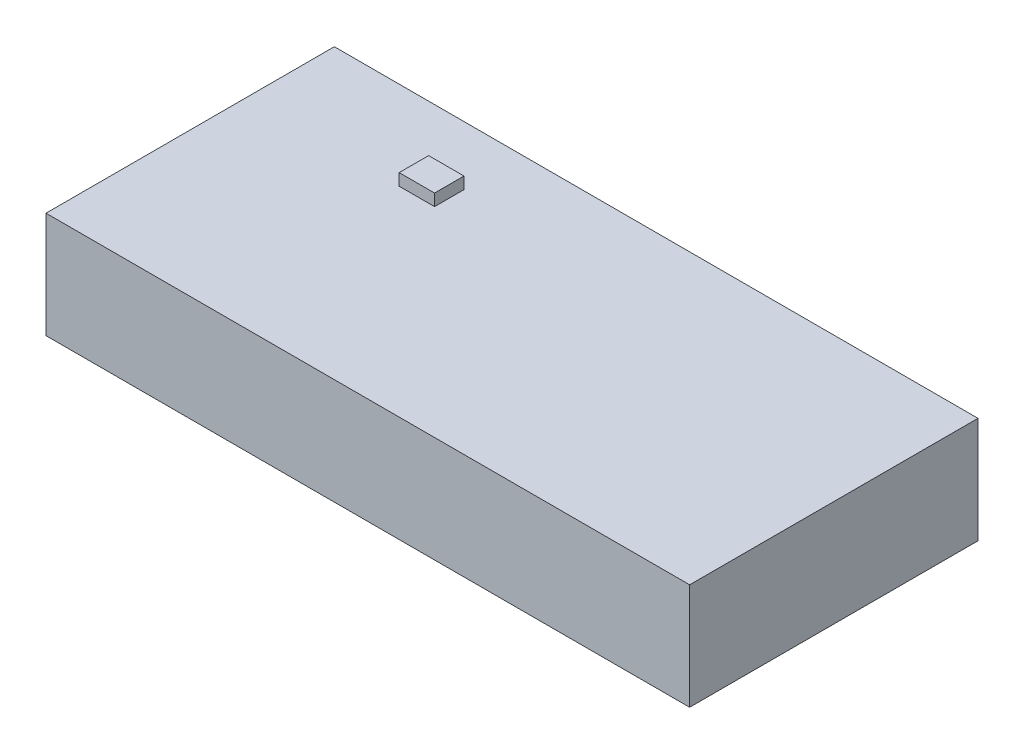
ISO-10303-21;
HEADER;
FILE_DESCRIPTION(('STEP AP214'),'2;1');
FILE_NAME('part.step','',(''),(''),'','','');
FILE_SCHEMA(('AUTOMOTIVE_DESIGN { 1 0 10303 214 1 1 1 1 }'));
ENDSEC;
DATA;
#1=APPLICATION_CONTEXT('core data for automotive mechanical design processes');
#2=APPLICATION_PROTOCOL_DEFINITION('international standard','automotive_design',2000,#1);
#3=PRODUCT_CONTEXT('',#1,'mechanical');
#4=PRODUCT('Part','Part','',(#3));
#5=PRODUCT_RELATED_PRODUCT_CATEGORY('part','',(#4));
#6=PRODUCT_DEFINITION_FORMATION('','',#4);
#7=PRODUCT_DEFINITION_CONTEXT('part definition',#1,'design');
#8=PRODUCT_DEFINITION('design','',#6,#7);
#9=PRODUCT_DEFINITION_SHAPE('','',#8);
#10=(LENGTH_UNIT() NAMED_UNIT(*) SI_UNIT(.MILLI.,.METRE.));
#11=(NAMED_UNIT(*) PLANE_ANGLE_UNIT() SI_UNIT($,.RADIAN.));
#12=(NAMED_UNIT(*) SI_UNIT($,.STERADIAN.) SOLID_ANGLE_UNIT());
#13=UNCERTAINTY_MEASURE_WITH_UNIT(LENGTH_MEASURE(1.E-05),#10,'distance_accuracy_value','');
#14=(GEOMETRIC_REPRESENTATION_CONTEXT(3) GLOBAL_UNCERTAINTY_ASSIGNED_CONTEXT((#13)) GLOBAL_UNIT_ASSIGNED_CONTEXT((#10,
#11,#12)) REPRESENTATION_CONTEXT('',''));
#15=CARTESIAN_POINT('',(0.,0.,0.));
#16=DIRECTION('',(0.,0.,1.));
#17=DIRECTION('',(1.,0.,0.));
#18=AXIS2_PLACEMENT_3D('',#15,#16,#17);
#19=CARTESIAN_POINT('',(0.,11.43,0.));
#20=DIRECTION('',(0.,1.,0.));
#21=DIRECTION('',(0.,0.,1.));
#22=AXIS2_PLACEMENT_3D('',#19,#20,#21);
#23=PLANE('',#22);
#24=DIRECTION('',(0.,0.,-1.));
#25=VECTOR('',#24,1.);
#26=CARTESIAN_POINT('',(69.342,11.43,-31.0642));
#27=LINE('',#26,#25);
#28=CARTESIAN_POINT('',(69.342,11.43,31.0642));
#29=VERTEX_POINT('',#28);
#30=CARTESIAN_POINT('',(69.342,11.43,-31.0642));
#31=VERTEX_POINT('',#30);
#32=EDGE_CURVE('E237',#29,#31,#27,.T.);
#33=ORIENTED_EDGE('',*,*,#32,.T.);
#34=DIRECTION('',(-1.,0.,0.));
#35=VECTOR('',#34,1.);
#36=CARTESIAN_POINT('',(-69.342,11.43,-31.0642));
#37=LINE('',#36,#35);
#38=CARTESIAN_POINT('',(-69.342,11.43,-31.0642));
#39=VERTEX_POINT('',#38);
#40=EDGE_CURVE('E240',#31,#39,#37,.T.);
#41=ORIENTED_EDGE('',*,*,#40,.T.);
#42=DIRECTION('',(0.,0.,1.));
#43=VECTOR('',#42,1.);
#44=CARTESIAN_POINT('',(-69.342,11.43,-31.0642));
#45=LINE('',#44,#43);
#46=CARTESIAN_POINT('',(-69.342,11.43,31.0642));
#47=VERTEX_POINT('',#46);
#48=EDGE_CURVE('E243',#39,#47,#45,.T.);
#49=ORIENTED_EDGE('',*,*,#48,.T.);
#50=DIRECTION('',(1.,0.,0.));
#51=VECTOR('',#50,1.);
#52=CARTESIAN_POINT('',(-69.342,11.43,31.0642));
#53=LINE('',#52,#51);
#54=EDGE_CURVE('E245',#47,#29,#53,.T.);
#55=ORIENTED_EDGE('',*,*,#54,.T.);
#56=EDGE_LOOP('',(#33,#41,#49,#55));
#57=FACE_BOUND('',#56,.T.);
#58=DIRECTION('',(-1.,0.,0.));
#59=VECTOR('',#58,1.);
#60=CARTESIAN_POINT('',(-36.322,11.43,-18.3642));
#61=LINE('',#60,#59);
#62=CARTESIAN_POINT('',(-28.702,11.43,-18.3642));
#63=VERTEX_POINT('',#62);
#64=CARTESIAN_POINT('',(-36.322,11.43,-18.3642));
#65=VERTEX_POINT('',#64);
#66=EDGE_CURVE('E478',#63,#65,#61,.T.);
#67=ORIENTED_EDGE('',*,*,#66,.F.);
#68=DIRECTION('',(0.,0.,-1.));
#69=VECTOR('',#68,1.);
#70=CARTESIAN_POINT('',(-28.702,11.43,-18.3642));
#71=LINE('',#70,#69);
#72=CARTESIAN_POINT('',(-28.702,11.43,-12.0142));
#73=VERTEX_POINT('',#72);
#74=EDGE_CURVE('E168',#73,#63,#71,.T.);
#75=ORIENTED_EDGE('',*,*,#74,.F.);
#76=DIRECTION('',(1.,0.,0.));
#77=VECTOR('',#76,1.);
#78=CARTESIAN_POINT('',(-36.322,11.43,-12.0142));
#79=LINE('',#78,#77);
#80=CARTESIAN_POINT('',(-36.322,11.43,-12.0142));
#81=VERTEX_POINT('',#80);
#82=EDGE_CURVE('E164',#81,#73,#79,.T.);
#83=ORIENTED_EDGE('',*,*,#82,.F.);
#84=DIRECTION('',(0.,0.,1.));
#85=VECTOR('',#84,1.);
#86=CARTESIAN_POINT('',(-36.322,11.43,-18.3642));
#87=LINE('',#86,#85);
#88=EDGE_CURVE('E475',#65,#81,#87,.T.);
#89=ORIENTED_EDGE('',*,*,#88,.F.);
#90=EDGE_LOOP('',(#67,#75,#83,#89));
#91=FACE_BOUND('',#90,.T.);
#92=ADVANCED_FACE('F32',(#57,#91),#23,.T.);
#93=CARTESIAN_POINT('',(69.342,11.43,-31.0642));
#94=DIRECTION('',(-1.,0.,0.));
#95=DIRECTION('',(0.,0.,1.));
#96=AXIS2_PLACEMENT_3D('',#93,#94,#95);
#97=PLANE('',#96);
#98=DIRECTION('',(0.,0.,-1.));
#99=VECTOR('',#98,1.);
#100=CARTESIAN_POINT('',(69.342,-11.43,-31.0642));
#101=LINE('',#100,#99);
#102=CARTESIAN_POINT('',(69.342,-11.43,31.0642));
#103=VERTEX_POINT('',#102);
#104=CARTESIAN_POINT('',(69.342,-11.43,-31.0642));
#105=VERTEX_POINT('',#104);
#106=EDGE_CURVE('E203',#103,#105,#101,.T.);
#107=ORIENTED_EDGE('',*,*,#106,.T.);
#108=DIRECTION('',(0.,-1.,0.));
#109=VECTOR('',#108,1.);
#110=CARTESIAN_POINT('',(69.342,11.43,-31.0642));
#111=LINE('',#110,#109);
#112=EDGE_CURVE('E11',#31,#105,#111,.T.);
#113=ORIENTED_EDGE('',*,*,#112,.F.);
#114=ORIENTED_EDGE('',*,*,#32,.F.);
#115=DIRECTION('',(0.,-1.,0.));
#116=VECTOR('',#115,1.);
#117=CARTESIAN_POINT('',(69.342,11.43,31.0642));
#118=LINE('',#117,#116);
#119=EDGE_CURVE('E247',#29,#103,#118,.T.);
#120=ORIENTED_EDGE('',*,*,#119,.T.);
#121=EDGE_LOOP('',(#107,#113,#114,#120));
#122=FACE_BOUND('',#121,.T.);
#123=ADVANCED_FACE('F34',(#122),#97,.F.);
#124=CARTESIAN_POINT('',(-69.342,11.43,-31.0642));
#125=DIRECTION('',(0.,0.,1.));
#126=DIRECTION('',(1.,0.,0.));
#127=AXIS2_PLACEMENT_3D('',#124,#125,#126);
#128=PLANE('',#127);
#129=DIRECTION('',(1.,0.,0.));
#130=VECTOR('',#129,1.);
#131=CARTESIAN_POINT('',(-23.622,3.175,-31.0642));
#132=LINE('',#131,#130);
#133=CARTESIAN_POINT('',(-36.322,3.175,-31.0642));
#134=VERTEX_POINT('',#133);
#135=CARTESIAN_POINT('',(-23.622,3.175,-31.0642));
#136=VERTEX_POINT('',#135);
#137=EDGE_CURVE('E192',#134,#136,#132,.T.);
#138=ORIENTED_EDGE('',*,*,#137,.F.);
#139=DIRECTION('',(0.,1.,0.));
#140=VECTOR('',#139,1.);
#141=CARTESIAN_POINT('',(-36.322,3.175,-31.0642));
#142=LINE('',#141,#140);
#143=CARTESIAN_POINT('',(-36.322,-3.175,-31.0642));
#144=VERTEX_POINT('',#143);
#145=EDGE_CURVE('E55',#144,#134,#142,.T.);
#146=ORIENTED_EDGE('',*,*,#145,.F.);
#147=DIRECTION('',(-1.,0.,0.));
#148=VECTOR('',#147,1.);
#149=CARTESIAN_POINT('',(-23.622,-3.175,-31.0642));
#150=LINE('',#149,#148);
#151=CARTESIAN_POINT('',(-23.622,-3.175,-31.0642));
#152=VERTEX_POINT('',#151);
#153=EDGE_CURVE('E181',#152,#144,#150,.T.);
#154=ORIENTED_EDGE('',*,*,#153,.F.);
#155=DIRECTION('',(0.,-1.,0.));
#156=VECTOR('',#155,1.);
#157=CARTESIAN_POINT('',(-23.622,3.175,-31.0642));
#158=LINE('',#157,#156);
#159=EDGE_CURVE('E196',#136,#152,#158,.T.);
#160=ORIENTED_EDGE('',*,*,#159,.F.);
#161=EDGE_LOOP('',(#138,#146,#154,#160));
#162=FACE_BOUND('',#161,.T.);
#163=DIRECTION('',(1.,0.,0.));
#164=VECTOR('',#163,1.);
#165=CARTESIAN_POINT('',(-43.942,3.175,-31.0642));
#166=LINE('',#165,#164);
#167=CARTESIAN_POINT('',(-56.642,3.175,-31.0642));
#168=VERTEX_POINT('',#167);
#169=CARTESIAN_POINT('',(-43.942,3.175,-31.0642));
#170=VERTEX_POINT('',#169);
#171=EDGE_CURVE('E172',#168,#170,#166,.T.);
#172=ORIENTED_EDGE('',*,*,#171,.F.);
#173=DIRECTION('',(0.,1.,0.));
#174=VECTOR('',#173,1.);
#175=CARTESIAN_POINT('',(-56.642,3.175,-31.0642));
#176=LINE('',#175,#174);
#177=CARTESIAN_POINT('',(-56.642,-3.175,-31.0642));
#178=VERTEX_POINT('',#177);
#179=EDGE_CURVE('E170',#178,#168,#176,.T.);
#180=ORIENTED_EDGE('',*,*,#179,.F.);
#181=DIRECTION('',(-1.,0.,0.));
#182=VECTOR('',#181,1.);
#183=CARTESIAN_POINT('',(-43.942,-3.175,-31.0642));
#184=LINE('',#183,#182);
#185=CARTESIAN_POINT('',(-43.942,-3.175,-31.0642));
#186=VERTEX_POINT('',#185);
#187=EDGE_CURVE('E213',#186,#178,#184,.T.);
#188=ORIENTED_EDGE('',*,*,#187,.F.);
#189=DIRECTION('',(0.,-1.,0.));
#190=VECTOR('',#189,1.);
#191=CARTESIAN_POINT('',(-43.942,3.175,-31.0642));
#192=LINE('',#191,#190);
#193=EDGE_CURVE('E225',#170,#186,#192,.T.);
#194=ORIENTED_EDGE('',*,*,#193,.F.);
#195=EDGE_LOOP('',(#172,#180,#188,#194));
#196=FACE_BOUND('',#195,.T.);
#197=DIRECTION('',(-1.,0.,0.));
#198=VECTOR('',#197,1.);
#199=CARTESIAN_POINT('',(-69.342,-11.43,-31.0642));
#200=LINE('',#199,#198);
#201=CARTESIAN_POINT('',(-69.342,-11.43,-31.0642));
#202=VERTEX_POINT('',#201);
#203=EDGE_CURVE('E250',#105,#202,#200,.T.);
#204=ORIENTED_EDGE('',*,*,#203,.T.);
#205=DIRECTION('',(0.,-1.,0.));
#206=VECTOR('',#205,1.);
#207=CARTESIAN_POINT('',(-69.342,11.43,-31.0642));
#208=LINE('',#207,#206);
#209=EDGE_CURVE('E40',#39,#202,#208,.T.);
#210=ORIENTED_EDGE('',*,*,#209,.F.);
#211=ORIENTED_EDGE('',*,*,#40,.F.);
#212=ORIENTED_EDGE('',*,*,#112,.T.);
#213=EDGE_LOOP('',(#204,#210,#211,#212));
#214=FACE_BOUND('',#213,.T.);
#215=ADVANCED_FACE('F280',(#162,#196,#214),#128,.F.);
#216=CARTESIAN_POINT('',(-69.342,11.43,-31.0642));
#217=DIRECTION('',(1.,0.,0.));
#218=DIRECTION('',(0.,0.,-1.));
#219=AXIS2_PLACEMENT_3D('',#216,#217,#218);
#220=PLANE('',#219);
#221=DIRECTION('',(0.,0.,1.));
#222=VECTOR('',#221,1.);
#223=CARTESIAN_POINT('',(-69.342,-11.43,-31.0642));
#224=LINE('',#223,#222);
#225=CARTESIAN_POINT('',(-69.342,-11.43,31.0642));
#226=VERTEX_POINT('',#225);
#227=EDGE_CURVE('E252',#202,#226,#224,.T.);
#228=ORIENTED_EDGE('',*,*,#227,.T.);
#229=DIRECTION('',(0.,-1.,0.));
#230=VECTOR('',#229,1.);
#231=CARTESIAN_POINT('',(-69.342,11.43,31.0642));
#232=LINE('',#231,#230);
#233=EDGE_CURVE('E257',#47,#226,#232,.T.);
#234=ORIENTED_EDGE('',*,*,#233,.F.);
#235=ORIENTED_EDGE('',*,*,#48,.F.);
#236=ORIENTED_EDGE('',*,*,#209,.T.);
#237=EDGE_LOOP('',(#228,#234,#235,#236));
#238=FACE_BOUND('',#237,.T.);
#239=ADVANCED_FACE('F264',(#238),#220,.F.);
#240=CARTESIAN_POINT('',(-69.342,11.43,31.0642));
#241=DIRECTION('',(0.,0.,-1.));
#242=DIRECTION('',(-1.,0.,0.));
#243=AXIS2_PLACEMENT_3D('',#240,#241,#242);
#244=PLANE('',#243);
#245=DIRECTION('',(1.,0.,0.));
#246=VECTOR('',#245,1.);
#247=CARTESIAN_POINT('',(-69.342,-11.43,31.0642));
#248=LINE('',#247,#246);
#249=EDGE_CURVE('E241',#226,#103,#248,.T.);
#250=ORIENTED_EDGE('',*,*,#249,.T.);
#251=ORIENTED_EDGE('',*,*,#119,.F.);
#252=ORIENTED_EDGE('',*,*,#54,.F.);
#253=ORIENTED_EDGE('',*,*,#233,.T.);
#254=EDGE_LOOP('',(#250,#251,#252,#253));
#255=FACE_BOUND('',#254,.T.);
#256=ADVANCED_FACE('F273',(#255),#244,.F.);
#257=CARTESIAN_POINT('',(0.,-11.43,0.));
#258=DIRECTION('',(0.,1.,0.));
#259=DIRECTION('',(0.,0.,1.));
#260=AXIS2_PLACEMENT_3D('',#257,#258,#259);
#261=PLANE('',#260);
#262=ORIENTED_EDGE('',*,*,#106,.F.);
#263=ORIENTED_EDGE('',*,*,#249,.F.);
#264=ORIENTED_EDGE('',*,*,#227,.F.);
#265=ORIENTED_EDGE('',*,*,#203,.F.);
#266=EDGE_LOOP('',(#262,#263,#264,#265));
#267=FACE_BOUND('',#266,.T.);
#268=ADVANCED_FACE('F270',(#267),#261,.F.);
#269=CARTESIAN_POINT('',(-56.642,3.175,-18.3642));
#270=DIRECTION('',(-1.,0.,0.));
#271=DIRECTION('',(0.,-1.,0.));
#272=AXIS2_PLACEMENT_3D('',#269,#270,#271);
#273=PLANE('',#272);
#274=ORIENTED_EDGE('',*,*,#179,.T.);
#275=DIRECTION('',(0.,0.,-1.));
#276=VECTOR('',#275,1.);
#277=CARTESIAN_POINT('',(-56.642,3.175,-18.3642));
#278=LINE('',#277,#276);
#279=CARTESIAN_POINT('',(-56.642,3.175,-18.3642));
#280=VERTEX_POINT('',#279);
#281=EDGE_CURVE('E221',#280,#168,#278,.T.);
#282=ORIENTED_EDGE('',*,*,#281,.F.);
#283=DIRECTION('',(0.,1.,0.));
#284=VECTOR('',#283,1.);
#285=CARTESIAN_POINT('',(-56.642,3.175,-18.3642));
#286=LINE('',#285,#284);
#287=CARTESIAN_POINT('',(-56.642,-3.175,-18.3642));
#288=VERTEX_POINT('',#287);
#289=EDGE_CURVE('E209',#288,#280,#286,.T.);
#290=ORIENTED_EDGE('',*,*,#289,.F.);
#291=DIRECTION('',(0.,0.,-1.));
#292=VECTOR('',#291,1.);
#293=CARTESIAN_POINT('',(-56.642,-3.175,-18.3642));
#294=LINE('',#293,#292);
#295=EDGE_CURVE('E193',#288,#178,#294,.T.);
#296=ORIENTED_EDGE('',*,*,#295,.T.);
#297=EDGE_LOOP('',(#274,#282,#290,#296));
#298=FACE_BOUND('',#297,.T.);
#299=ADVANCED_FACE('F296',(#298),#273,.F.);
#300=CARTESIAN_POINT('',(-43.942,-3.175,-18.3642));
#301=DIRECTION('',(0.,-1.,0.));
#302=DIRECTION('',(0.,0.,-1.));
#303=AXIS2_PLACEMENT_3D('',#300,#301,#302);
#304=PLANE('',#303);
#305=ORIENTED_EDGE('',*,*,#187,.T.);
#306=ORIENTED_EDGE('',*,*,#295,.F.);
#307=DIRECTION('',(-1.,0.,0.));
#308=VECTOR('',#307,1.);
#309=CARTESIAN_POINT('',(-43.942,-3.175,-18.3642));
#310=LINE('',#309,#308);
#311=CARTESIAN_POINT('',(-43.942,-3.175,-18.3642));
#312=VERTEX_POINT('',#311);
#313=EDGE_CURVE('E219',#312,#288,#310,.T.);
#314=ORIENTED_EDGE('',*,*,#313,.F.);
#315=DIRECTION('',(0.,0.,-1.));
#316=VECTOR('',#315,1.);
#317=CARTESIAN_POINT('',(-43.942,-3.175,-18.3642));
#318=LINE('',#317,#316);
#319=EDGE_CURVE('E231',#312,#186,#318,.T.);
#320=ORIENTED_EDGE('',*,*,#319,.T.);
#321=EDGE_LOOP('',(#305,#306,#314,#320));
#322=FACE_BOUND('',#321,.T.);
#323=ADVANCED_FACE('F315',(#322),#304,.F.);
#324=CARTESIAN_POINT('',(-43.942,3.175,-18.3642));
#325=DIRECTION('',(1.,0.,0.));
#326=DIRECTION('',(0.,0.,-1.));
#327=AXIS2_PLACEMENT_3D('',#324,#325,#326);
#328=PLANE('',#327);
#329=ORIENTED_EDGE('',*,*,#193,.T.);
#330=ORIENTED_EDGE('',*,*,#319,.F.);
#331=DIRECTION('',(0.,-1.,0.));
#332=VECTOR('',#331,1.);
#333=CARTESIAN_POINT('',(-43.942,3.175,-18.3642));
#334=LINE('',#333,#332);
#335=CARTESIAN_POINT('',(-43.942,3.175,-18.3642));
#336=VERTEX_POINT('',#335);
#337=EDGE_CURVE('E216',#336,#312,#334,.T.);
#338=ORIENTED_EDGE('',*,*,#337,.F.);
#339=DIRECTION('',(0.,0.,-1.));
#340=VECTOR('',#339,1.);
#341=CARTESIAN_POINT('',(-43.942,3.175,-18.3642));
#342=LINE('',#341,#340);
#343=EDGE_CURVE('E233',#336,#170,#342,.T.);
#344=ORIENTED_EDGE('',*,*,#343,.T.);
#345=EDGE_LOOP('',(#329,#330,#338,#344));
#346=FACE_BOUND('',#345,.T.);
#347=ADVANCED_FACE('F322',(#346),#328,.F.);
#348=CARTESIAN_POINT('',(-43.942,3.175,-18.3642));
#349=DIRECTION('',(0.,1.,0.));
#350=DIRECTION('',(0.,0.,1.));
#351=AXIS2_PLACEMENT_3D('',#348,#349,#350);
#352=PLANE('',#351);
#353=ORIENTED_EDGE('',*,*,#171,.T.);
#354=ORIENTED_EDGE('',*,*,#343,.F.);
#355=DIRECTION('',(1.,0.,0.));
#356=VECTOR('',#355,1.);
#357=CARTESIAN_POINT('',(-43.942,3.175,-18.3642));
#358=LINE('',#357,#356);
#359=EDGE_CURVE('E212',#280,#336,#358,.T.);
#360=ORIENTED_EDGE('',*,*,#359,.F.);
#361=ORIENTED_EDGE('',*,*,#281,.T.);
#362=EDGE_LOOP('',(#353,#354,#360,#361));
#363=FACE_BOUND('',#362,.T.);
#364=ADVANCED_FACE('F330',(#363),#352,.F.);
#365=CARTESIAN_POINT('',(0.,0.,-18.3642));
#366=DIRECTION('',(0.,0.,-1.));
#367=DIRECTION('',(-1.,0.,0.));
#368=AXIS2_PLACEMENT_3D('',#365,#366,#367);
#369=PLANE('',#368);
#370=ORIENTED_EDGE('',*,*,#289,.T.);
#371=ORIENTED_EDGE('',*,*,#359,.T.);
#372=ORIENTED_EDGE('',*,*,#337,.T.);
#373=ORIENTED_EDGE('',*,*,#313,.T.);
#374=EDGE_LOOP('',(#370,#371,#372,#373));
#375=FACE_BOUND('',#374,.T.);
#376=ADVANCED_FACE('F338',(#375),#369,.T.);
#377=CARTESIAN_POINT('',(-36.322,3.175,-18.3642));
#378=DIRECTION('',(-1.,0.,0.));
#379=DIRECTION('',(0.,-1.,0.));
#380=AXIS2_PLACEMENT_3D('',#377,#378,#379);
#381=PLANE('',#380);
#382=ORIENTED_EDGE('',*,*,#145,.T.);
#383=DIRECTION('',(0.,0.,-1.));
#384=VECTOR('',#383,1.);
#385=CARTESIAN_POINT('',(-36.322,3.175,-18.3642));
#386=LINE('',#385,#384);
#387=CARTESIAN_POINT('',(-36.322,3.175,-18.3642));
#388=VERTEX_POINT('',#387);
#389=EDGE_CURVE('E190',#388,#134,#386,.T.);
#390=ORIENTED_EDGE('',*,*,#389,.F.);
#391=DIRECTION('',(0.,1.,0.));
#392=VECTOR('',#391,1.);
#393=CARTESIAN_POINT('',(-36.322,3.175,-18.3642));
#394=LINE('',#393,#392);
#395=CARTESIAN_POINT('',(-36.322,-3.175,-18.3642));
#396=VERTEX_POINT('',#395);
#397=EDGE_CURVE('E177',#396,#388,#394,.T.);
#398=ORIENTED_EDGE('',*,*,#397,.F.);
#399=DIRECTION('',(0.,0.,-1.));
#400=VECTOR('',#399,1.);
#401=CARTESIAN_POINT('',(-36.322,-3.175,-18.3642));
#402=LINE('',#401,#400);
#403=EDGE_CURVE('E201',#396,#144,#402,.T.);
#404=ORIENTED_EDGE('',*,*,#403,.T.);
#405=EDGE_LOOP('',(#382,#390,#398,#404));
#406=FACE_BOUND('',#405,.T.);
#407=ADVANCED_FACE('F345',(#406),#381,.F.);
#408=CARTESIAN_POINT('',(-23.622,-3.175,-18.3642));
#409=DIRECTION('',(0.,-1.,0.));
#410=DIRECTION('',(0.,0.,-1.));
#411=AXIS2_PLACEMENT_3D('',#408,#409,#410);
#412=PLANE('',#411);
#413=ORIENTED_EDGE('',*,*,#153,.T.);
#414=ORIENTED_EDGE('',*,*,#403,.F.);
#415=DIRECTION('',(-1.,0.,0.));
#416=VECTOR('',#415,1.);
#417=CARTESIAN_POINT('',(-23.622,-3.175,-18.3642));
#418=LINE('',#417,#416);
#419=CARTESIAN_POINT('',(-23.622,-3.175,-18.3642));
#420=VERTEX_POINT('',#419);
#421=EDGE_CURVE('E187',#420,#396,#418,.T.);
#422=ORIENTED_EDGE('',*,*,#421,.F.);
#423=DIRECTION('',(0.,0.,-1.));
#424=VECTOR('',#423,1.);
#425=CARTESIAN_POINT('',(-23.622,-3.175,-18.3642));
#426=LINE('',#425,#424);
#427=EDGE_CURVE('E204',#420,#152,#426,.T.);
#428=ORIENTED_EDGE('',*,*,#427,.T.);
#429=EDGE_LOOP('',(#413,#414,#422,#428));
#430=FACE_BOUND('',#429,.T.);
#431=ADVANCED_FACE('F353',(#430),#412,.F.);
#432=CARTESIAN_POINT('',(-23.622,3.175,-18.3642));
#433=DIRECTION('',(1.,0.,0.));
#434=DIRECTION('',(0.,0.,-1.));
#435=AXIS2_PLACEMENT_3D('',#432,#433,#434);
#436=PLANE('',#435);
#437=ORIENTED_EDGE('',*,*,#159,.T.);
#438=ORIENTED_EDGE('',*,*,#427,.F.);
#439=DIRECTION('',(0.,-1.,0.));
#440=VECTOR('',#439,1.);
#441=CARTESIAN_POINT('',(-23.622,3.175,-18.3642));
#442=LINE('',#441,#440);
#443=CARTESIAN_POINT('',(-23.622,3.175,-18.3642));
#444=VERTEX_POINT('',#443);
#445=EDGE_CURVE('E184',#444,#420,#442,.T.);
#446=ORIENTED_EDGE('',*,*,#445,.F.);
#447=DIRECTION('',(0.,0.,-1.));
#448=VECTOR('',#447,1.);
#449=CARTESIAN_POINT('',(-23.622,3.175,-18.3642));
#450=LINE('',#449,#448);
#451=EDGE_CURVE('E206',#444,#136,#450,.T.);
#452=ORIENTED_EDGE('',*,*,#451,.T.);
#453=EDGE_LOOP('',(#437,#438,#446,#452));
#454=FACE_BOUND('',#453,.T.);
#455=ADVANCED_FACE('F360',(#454),#436,.F.);
#456=CARTESIAN_POINT('',(-23.622,3.175,-18.3642));
#457=DIRECTION('',(0.,1.,0.));
#458=DIRECTION('',(0.,0.,1.));
#459=AXIS2_PLACEMENT_3D('',#456,#457,#458);
#460=PLANE('',#459);
#461=ORIENTED_EDGE('',*,*,#137,.T.);
#462=ORIENTED_EDGE('',*,*,#451,.F.);
#463=DIRECTION('',(1.,0.,0.));
#464=VECTOR('',#463,1.);
#465=CARTESIAN_POINT('',(-23.622,3.175,-18.3642));
#466=LINE('',#465,#464);
#467=EDGE_CURVE('E180',#388,#444,#466,.T.);
#468=ORIENTED_EDGE('',*,*,#467,.F.);
#469=ORIENTED_EDGE('',*,*,#389,.T.);
#470=EDGE_LOOP('',(#461,#462,#468,#469));
#471=FACE_BOUND('',#470,.T.);
#472=ADVANCED_FACE('F368',(#471),#460,.F.);
#473=CARTESIAN_POINT('',(0.,0.,-18.3642));
#474=DIRECTION('',(0.,0.,-1.));
#475=DIRECTION('',(-1.,0.,0.));
#476=AXIS2_PLACEMENT_3D('',#473,#474,#475);
#477=PLANE('',#476);
#478=ORIENTED_EDGE('',*,*,#397,.T.);
#479=ORIENTED_EDGE('',*,*,#467,.T.);
#480=ORIENTED_EDGE('',*,*,#445,.T.);
#481=ORIENTED_EDGE('',*,*,#421,.T.);
#482=EDGE_LOOP('',(#478,#479,#480,#481));
#483=FACE_BOUND('',#482,.T.);
#484=ADVANCED_FACE('F376',(#483),#477,.T.);
#485=CARTESIAN_POINT('',(-28.702,13.97,-18.3642));
#486=DIRECTION('',(-1.,0.,0.));
#487=DIRECTION('',(0.,0.,1.));
#488=AXIS2_PLACEMENT_3D('',#485,#486,#487);
#489=PLANE('',#488);
#490=ORIENTED_EDGE('',*,*,#74,.T.);
#491=DIRECTION('',(0.,-1.,0.));
#492=VECTOR('',#491,1.);
#493=CARTESIAN_POINT('',(-28.702,13.97,-18.3642));
#494=LINE('',#493,#492);
#495=CARTESIAN_POINT('',(-28.702,13.97,-18.3642));
#496=VERTEX_POINT('',#495);
#497=EDGE_CURVE('E149',#496,#63,#494,.T.);
#498=ORIENTED_EDGE('',*,*,#497,.F.);
#499=DIRECTION('',(0.,0.,-1.));
#500=VECTOR('',#499,1.);
#501=CARTESIAN_POINT('',(-28.702,13.97,-18.3642));
#502=LINE('',#501,#500);
#503=CARTESIAN_POINT('',(-28.702,13.97,-12.0142));
#504=VERTEX_POINT('',#503);
#505=EDGE_CURVE('E156',#504,#496,#502,.T.);
#506=ORIENTED_EDGE('',*,*,#505,.F.);
#507=DIRECTION('',(0.,-1.,0.));
#508=VECTOR('',#507,1.);
#509=CARTESIAN_POINT('',(-28.702,13.97,-12.0142));
#510=LINE('',#509,#508);
#511=EDGE_CURVE('E473',#504,#73,#510,.T.);
#512=ORIENTED_EDGE('',*,*,#511,.T.);
#513=EDGE_LOOP('',(#490,#498,#506,#512));
#514=FACE_BOUND('',#513,.T.);
#515=ADVANCED_FACE('F166',(#514),#489,.F.);
#516=CARTESIAN_POINT('',(-36.322,13.97,-18.3642));
#517=DIRECTION('',(0.,0.,1.));
#518=DIRECTION('',(1.,0.,0.));
#519=AXIS2_PLACEMENT_3D('',#516,#517,#518);
#520=PLANE('',#519);
#521=ORIENTED_EDGE('',*,*,#66,.T.);
#522=DIRECTION('',(0.,-1.,0.));
#523=VECTOR('',#522,1.);
#524=CARTESIAN_POINT('',(-36.322,13.97,-18.3642));
#525=LINE('',#524,#523);
#526=CARTESIAN_POINT('',(-36.322,13.97,-18.3642));
#527=VERTEX_POINT('',#526);
#528=EDGE_CURVE('E152',#527,#65,#525,.T.);
#529=ORIENTED_EDGE('',*,*,#528,.F.);
#530=DIRECTION('',(-1.,0.,0.));
#531=VECTOR('',#530,1.);
#532=CARTESIAN_POINT('',(-36.322,13.97,-18.3642));
#533=LINE('',#532,#531);
#534=EDGE_CURVE('E145',#496,#527,#533,.T.);
#535=ORIENTED_EDGE('',*,*,#534,.F.);
#536=ORIENTED_EDGE('',*,*,#497,.T.);
#537=EDGE_LOOP('',(#521,#529,#535,#536));
#538=FACE_BOUND('',#537,.T.);
#539=ADVANCED_FACE('F147',(#538),#520,.F.);
#540=CARTESIAN_POINT('',(-36.322,13.97,-18.3642));
#541=DIRECTION('',(1.,0.,0.));
#542=DIRECTION('',(0.,0.,-1.));
#543=AXIS2_PLACEMENT_3D('',#540,#541,#542);
#544=PLANE('',#543);
#545=ORIENTED_EDGE('',*,*,#88,.T.);
#546=DIRECTION('',(0.,-1.,0.));
#547=VECTOR('',#546,1.);
#548=CARTESIAN_POINT('',(-36.322,13.97,-12.0142));
#549=LINE('',#548,#547);
#550=CARTESIAN_POINT('',(-36.322,13.97,-12.0142));
#551=VERTEX_POINT('',#550);
#552=EDGE_CURVE('E47',#551,#81,#549,.T.);
#553=ORIENTED_EDGE('',*,*,#552,.F.);
#554=DIRECTION('',(0.,0.,1.));
#555=VECTOR('',#554,1.);
#556=CARTESIAN_POINT('',(-36.322,13.97,-18.3642));
#557=LINE('',#556,#555);
#558=EDGE_CURVE('E155',#527,#551,#557,.T.);
#559=ORIENTED_EDGE('',*,*,#558,.F.);
#560=ORIENTED_EDGE('',*,*,#528,.T.);
#561=EDGE_LOOP('',(#545,#553,#559,#560));
#562=FACE_BOUND('',#561,.T.);
#563=ADVANCED_FACE('F397',(#562),#544,.F.);
#564=CARTESIAN_POINT('',(-36.322,13.97,-12.0142));
#565=DIRECTION('',(0.,0.,-1.));
#566=DIRECTION('',(-1.,0.,0.));
#567=AXIS2_PLACEMENT_3D('',#564,#565,#566);
#568=PLANE('',#567);
#569=ORIENTED_EDGE('',*,*,#82,.T.);
#570=ORIENTED_EDGE('',*,*,#511,.F.);
#571=DIRECTION('',(1.,0.,0.));
#572=VECTOR('',#571,1.);
#573=CARTESIAN_POINT('',(-36.322,13.97,-12.0142));
#574=LINE('',#573,#572);
#575=EDGE_CURVE('E160',#551,#504,#574,.T.);
#576=ORIENTED_EDGE('',*,*,#575,.F.);
#577=ORIENTED_EDGE('',*,*,#552,.T.);
#578=EDGE_LOOP('',(#569,#570,#576,#577));
#579=FACE_BOUND('',#578,.T.);
#580=ADVANCED_FACE('F404',(#579),#568,.F.);
#581=CARTESIAN_POINT('',(0.,13.97,0.));
#582=DIRECTION('',(0.,1.,0.));
#583=DIRECTION('',(0.,0.,1.));
#584=AXIS2_PLACEMENT_3D('',#581,#582,#583);
#585=PLANE('',#584);
#586=ORIENTED_EDGE('',*,*,#505,.T.);
#587=ORIENTED_EDGE('',*,*,#534,.T.);
#588=ORIENTED_EDGE('',*,*,#558,.T.);
#589=ORIENTED_EDGE('',*,*,#575,.T.);
#590=EDGE_LOOP('',(#586,#587,#588,#589));
#591=FACE_BOUND('',#590,.T.);
#592=ADVANCED_FACE('F159',(#591),#585,.T.);
#593=CLOSED_SHELL('',(#92,#123,#215,#239,#256,#268,#299,#323,#347,#364,#376,#407,#431,#455,#472,
#484,#515,#539,#563,#580,#592));
#594=MANIFOLD_SOLID_BREP('B2',#593);
#595=ADVANCED_BREP_SHAPE_REPRESENTATION('',(#18,#594),#14);
#596=SHAPE_DEFINITION_REPRESENTATION(#9,#595);
ENDSEC;
END-ISO-10303-21;
